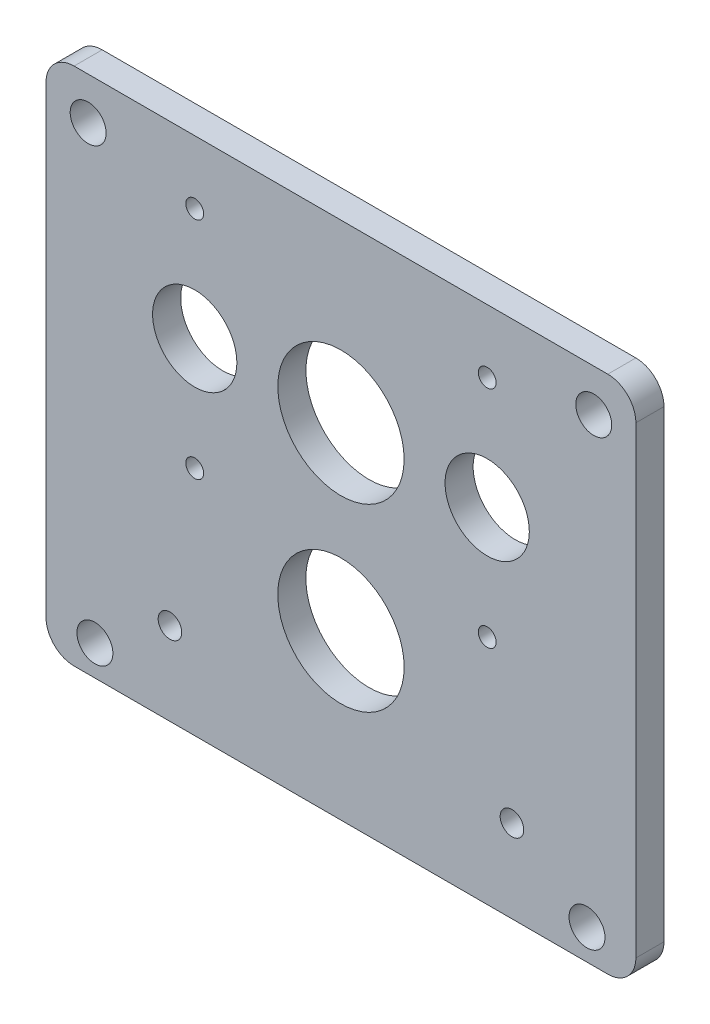
ISO-10303-21;
HEADER;
FILE_DESCRIPTION(('STEP AP214'),'2;1');
FILE_NAME('part.step','',(''),(''),'','','');
FILE_SCHEMA(('AUTOMOTIVE_DESIGN { 1 0 10303 214 1 1 1 1 }'));
ENDSEC;
DATA;
#1=APPLICATION_CONTEXT('core data for automotive mechanical design processes');
#2=APPLICATION_PROTOCOL_DEFINITION('international standard','automotive_design',2000,#1);
#3=PRODUCT_CONTEXT('',#1,'mechanical');
#4=PRODUCT('Part','Part','',(#3));
#5=PRODUCT_RELATED_PRODUCT_CATEGORY('part','',(#4));
#6=PRODUCT_DEFINITION_FORMATION('','',#4);
#7=PRODUCT_DEFINITION_CONTEXT('part definition',#1,'design');
#8=PRODUCT_DEFINITION('design','',#6,#7);
#9=PRODUCT_DEFINITION_SHAPE('','',#8);
#10=(LENGTH_UNIT() NAMED_UNIT(*) SI_UNIT(.MILLI.,.METRE.));
#11=(NAMED_UNIT(*) PLANE_ANGLE_UNIT() SI_UNIT($,.RADIAN.));
#12=(NAMED_UNIT(*) SI_UNIT($,.STERADIAN.) SOLID_ANGLE_UNIT());
#13=UNCERTAINTY_MEASURE_WITH_UNIT(LENGTH_MEASURE(1.E-05),#10,'distance_accuracy_value','');
#14=(GEOMETRIC_REPRESENTATION_CONTEXT(3) GLOBAL_UNCERTAINTY_ASSIGNED_CONTEXT((#13)) GLOBAL_UNIT_ASSIGNED_CONTEXT((#10,
#11,#12)) REPRESENTATION_CONTEXT('',''));
#15=CARTESIAN_POINT('',(0.,0.,0.));
#16=DIRECTION('',(0.,0.,1.));
#17=DIRECTION('',(1.,0.,0.));
#18=AXIS2_PLACEMENT_3D('',#15,#16,#17);
#19=CARTESIAN_POINT('',(0.,0.,3.175));
#20=DIRECTION('',(0.,0.,1.));
#21=DIRECTION('',(1.,0.,0.));
#22=AXIS2_PLACEMENT_3D('',#19,#20,#21);
#23=PLANE('',#22);
#24=CARTESIAN_POINT('',(57.15,70.8914,3.175));
#25=DIRECTION('',(0.,0.,1.));
#26=DIRECTION('',(1.,0.,0.));
#27=AXIS2_PLACEMENT_3D('',#24,#25,#26);
#28=CIRCLE('',#27,4.064);
#29=CARTESIAN_POINT('',(61.214,70.8914,3.175));
#30=VERTEX_POINT('',#29);
#31=EDGE_CURVE('E247',#30,#30,#28,.T.);
#32=ORIENTED_EDGE('',*,*,#31,.F.);
#33=EDGE_LOOP('',(#32));
#34=FACE_BOUND('',#33,.T.);
#35=CARTESIAN_POINT('',(-55.626,-30.2006,3.175));
#36=DIRECTION('',(0.,0.,1.));
#37=DIRECTION('',(1.,0.,0.));
#38=AXIS2_PLACEMENT_3D('',#35,#36,#37);
#39=CIRCLE('',#38,4.06400000000001);
#40=CARTESIAN_POINT('',(-51.562,-30.2006,3.175));
#41=VERTEX_POINT('',#40);
#42=EDGE_CURVE('E235',#41,#41,#39,.T.);
#43=ORIENTED_EDGE('',*,*,#42,.F.);
#44=EDGE_LOOP('',(#43));
#45=FACE_BOUND('',#44,.T.);
#46=CARTESIAN_POINT('',(-38.6588,-18.3134,3.175));
#47=DIRECTION('',(0.,0.,1.));
#48=DIRECTION('',(1.,0.,0.));
#49=AXIS2_PLACEMENT_3D('',#46,#47,#48);
#50=CIRCLE('',#49,2.667);
#51=CARTESIAN_POINT('',(-35.9918,-18.3134,3.175));
#52=VERTEX_POINT('',#51);
#53=EDGE_CURVE('E223',#52,#52,#50,.T.);
#54=ORIENTED_EDGE('',*,*,#53,.F.);
#55=EDGE_LOOP('',(#54));
#56=FACE_BOUND('',#55,.T.);
#57=CARTESIAN_POINT('',(-57.15,70.8914,3.175));
#58=DIRECTION('',(0.,0.,1.));
#59=DIRECTION('',(1.,0.,0.));
#60=AXIS2_PLACEMENT_3D('',#57,#58,#59);
#61=CIRCLE('',#60,4.064);
#62=CARTESIAN_POINT('',(-53.086,70.8914,3.175));
#63=VERTEX_POINT('',#62);
#64=EDGE_CURVE('E211',#63,#63,#61,.T.);
#65=ORIENTED_EDGE('',*,*,#64,.F.);
#66=EDGE_LOOP('',(#65));
#67=FACE_BOUND('',#66,.T.);
#68=CARTESIAN_POINT('',(0.,0.,3.175));
#69=DIRECTION('',(0.,0.,1.));
#70=DIRECTION('',(1.,0.,0.));
#71=AXIS2_PLACEMENT_3D('',#68,#69,#70);
#72=CIRCLE('',#71,14.2875);
#73=CARTESIAN_POINT('',(14.2875,0.,3.175));
#74=VERTEX_POINT('',#73);
#75=EDGE_CURVE('E199',#74,#74,#72,.T.);
#76=ORIENTED_EDGE('',*,*,#75,.F.);
#77=EDGE_LOOP('',(#76));
#78=FACE_BOUND('',#77,.T.);
#79=CARTESIAN_POINT('',(-33.0581,40.7162,3.175));
#80=DIRECTION('',(0.,0.,1.));
#81=DIRECTION('',(1.,0.,0.));
#82=AXIS2_PLACEMENT_3D('',#79,#80,#81);
#83=CIRCLE('',#82,9.525);
#84=CARTESIAN_POINT('',(-23.5331,40.7162,3.175));
#85=VERTEX_POINT('',#84);
#86=EDGE_CURVE('E187',#85,#85,#83,.T.);
#87=ORIENTED_EDGE('',*,*,#86,.F.);
#88=EDGE_LOOP('',(#87));
#89=FACE_BOUND('',#88,.T.);
#90=CARTESIAN_POINT('',(0.,40.7162,3.175));
#91=DIRECTION('',(0.,0.,1.));
#92=DIRECTION('',(1.,0.,0.));
#93=AXIS2_PLACEMENT_3D('',#90,#91,#92);
#94=CIRCLE('',#93,14.2748);
#95=CARTESIAN_POINT('',(14.2748,40.7162,3.175));
#96=VERTEX_POINT('',#95);
#97=EDGE_CURVE('E133',#96,#96,#94,.T.);
#98=ORIENTED_EDGE('',*,*,#97,.F.);
#99=EDGE_LOOP('',(#98));
#100=FACE_BOUND('',#99,.T.);
#101=DIRECTION('',(0.,1.,0.));
#102=VECTOR('',#101,1.);
#103=CARTESIAN_POINT('',(66.675,80.4164,3.175));
#104=LINE('',#103,#102);
#105=CARTESIAN_POINT('',(66.675,-30.7086,3.175));
#106=VERTEX_POINT('',#105);
#107=CARTESIAN_POINT('',(66.675,74.0664,3.175));
#108=VERTEX_POINT('',#107);
#109=EDGE_CURVE('E138',#106,#108,#104,.T.);
#110=ORIENTED_EDGE('',*,*,#109,.T.);
#111=CARTESIAN_POINT('',(60.325,74.0664,3.175));
#112=DIRECTION('',(0.,0.,1.));
#113=DIRECTION('',(1.,0.,0.));
#114=AXIS2_PLACEMENT_3D('',#111,#112,#113);
#115=CIRCLE('',#114,6.35);
#116=CARTESIAN_POINT('',(60.325,80.4164,3.175));
#117=VERTEX_POINT('',#116);
#118=EDGE_CURVE('E153',#108,#117,#115,.T.);
#119=ORIENTED_EDGE('',*,*,#118,.T.);
#120=DIRECTION('',(-1.,0.,0.));
#121=VECTOR('',#120,1.);
#122=CARTESIAN_POINT('',(-66.675,80.4164,3.175));
#123=LINE('',#122,#121);
#124=CARTESIAN_POINT('',(-60.325,80.4164,3.175));
#125=VERTEX_POINT('',#124);
#126=EDGE_CURVE('E120',#117,#125,#123,.T.);
#127=ORIENTED_EDGE('',*,*,#126,.T.);
#128=CARTESIAN_POINT('',(-60.325,74.0664,3.175));
#129=DIRECTION('',(0.,0.,1.));
#130=DIRECTION('',(1.,0.,0.));
#131=AXIS2_PLACEMENT_3D('',#128,#129,#130);
#132=CIRCLE('',#131,6.35);
#133=CARTESIAN_POINT('',(-66.675,74.0664,3.175));
#134=VERTEX_POINT('',#133);
#135=EDGE_CURVE('E148',#125,#134,#132,.T.);
#136=ORIENTED_EDGE('',*,*,#135,.T.);
#137=DIRECTION('',(0.,-1.,0.));
#138=VECTOR('',#137,1.);
#139=CARTESIAN_POINT('',(-66.675,80.4164,3.175));
#140=LINE('',#139,#138);
#141=CARTESIAN_POINT('',(-66.675,-30.7086,3.175));
#142=VERTEX_POINT('',#141);
#143=EDGE_CURVE('E164',#134,#142,#140,.T.);
#144=ORIENTED_EDGE('',*,*,#143,.T.);
#145=CARTESIAN_POINT('',(-60.325,-30.7086,3.175));
#146=DIRECTION('',(0.,0.,1.));
#147=DIRECTION('',(1.,0.,0.));
#148=AXIS2_PLACEMENT_3D('',#145,#146,#147);
#149=CIRCLE('',#148,6.35);
#150=CARTESIAN_POINT('',(-60.325,-37.0586,3.175));
#151=VERTEX_POINT('',#150);
#152=EDGE_CURVE('E56',#142,#151,#149,.T.);
#153=ORIENTED_EDGE('',*,*,#152,.T.);
#154=DIRECTION('',(1.,0.,0.));
#155=VECTOR('',#154,1.);
#156=CARTESIAN_POINT('',(-66.675,-37.0586,3.175));
#157=LINE('',#156,#155);
#158=CARTESIAN_POINT('',(60.325,-37.0586,3.175));
#159=VERTEX_POINT('',#158);
#160=EDGE_CURVE('E139',#151,#159,#157,.T.);
#161=ORIENTED_EDGE('',*,*,#160,.T.);
#162=CARTESIAN_POINT('',(60.325,-30.7086,3.175));
#163=DIRECTION('',(0.,0.,1.));
#164=DIRECTION('',(1.,0.,0.));
#165=AXIS2_PLACEMENT_3D('',#162,#163,#164);
#166=CIRCLE('',#165,6.35);
#167=EDGE_CURVE('E151',#159,#106,#166,.T.);
#168=ORIENTED_EDGE('',*,*,#167,.T.);
#169=EDGE_LOOP('',(#110,#119,#127,#136,#144,#153,#161,#168));
#170=FACE_BOUND('',#169,.T.);
#171=CARTESIAN_POINT('',(33.0581,40.7162,3.175));
#172=DIRECTION('',(0.,0.,1.));
#173=DIRECTION('',(1.,0.,0.));
#174=AXIS2_PLACEMENT_3D('',#171,#172,#173);
#175=CIRCLE('',#174,9.52500000000001);
#176=CARTESIAN_POINT('',(42.5831,40.7162,3.175));
#177=VERTEX_POINT('',#176);
#178=EDGE_CURVE('E181',#177,#177,#175,.T.);
#179=ORIENTED_EDGE('',*,*,#178,.F.);
#180=EDGE_LOOP('',(#179));
#181=FACE_BOUND('',#180,.T.);
#182=CARTESIAN_POINT('',(-33.0581,66.1162,3.175));
#183=DIRECTION('',(0.,0.,1.));
#184=DIRECTION('',(1.,0.,0.));
#185=AXIS2_PLACEMENT_3D('',#182,#183,#184);
#186=CIRCLE('',#185,2.0193);
#187=CARTESIAN_POINT('',(-31.0388,66.1162,3.175));
#188=VERTEX_POINT('',#187);
#189=EDGE_CURVE('E193',#188,#188,#186,.T.);
#190=ORIENTED_EDGE('',*,*,#189,.F.);
#191=EDGE_LOOP('',(#190));
#192=FACE_BOUND('',#191,.T.);
#193=CARTESIAN_POINT('',(-33.0581,15.3162,3.175));
#194=DIRECTION('',(0.,0.,1.));
#195=DIRECTION('',(1.,0.,0.));
#196=AXIS2_PLACEMENT_3D('',#193,#194,#195);
#197=CIRCLE('',#196,2.0193);
#198=CARTESIAN_POINT('',(-31.0388,15.3162,3.175));
#199=VERTEX_POINT('',#198);
#200=EDGE_CURVE('E205',#199,#199,#197,.T.);
#201=ORIENTED_EDGE('',*,*,#200,.F.);
#202=EDGE_LOOP('',(#201));
#203=FACE_BOUND('',#202,.T.);
#204=CARTESIAN_POINT('',(38.6588,-18.3134,3.175));
#205=DIRECTION('',(0.,0.,1.));
#206=DIRECTION('',(1.,0.,0.));
#207=AXIS2_PLACEMENT_3D('',#204,#205,#206);
#208=CIRCLE('',#207,2.667);
#209=CARTESIAN_POINT('',(41.3258,-18.3134,3.175));
#210=VERTEX_POINT('',#209);
#211=EDGE_CURVE('E217',#210,#210,#208,.T.);
#212=ORIENTED_EDGE('',*,*,#211,.F.);
#213=EDGE_LOOP('',(#212));
#214=FACE_BOUND('',#213,.T.);
#215=CARTESIAN_POINT('',(33.0581,66.1162,3.175));
#216=DIRECTION('',(0.,0.,1.));
#217=DIRECTION('',(1.,0.,0.));
#218=AXIS2_PLACEMENT_3D('',#215,#216,#217);
#219=CIRCLE('',#218,2.0193);
#220=CARTESIAN_POINT('',(35.0774,66.1162,3.175));
#221=VERTEX_POINT('',#220);
#222=EDGE_CURVE('E229',#221,#221,#219,.T.);
#223=ORIENTED_EDGE('',*,*,#222,.F.);
#224=EDGE_LOOP('',(#223));
#225=FACE_BOUND('',#224,.T.);
#226=CARTESIAN_POINT('',(33.0581,15.3162,3.175));
#227=DIRECTION('',(0.,0.,1.));
#228=DIRECTION('',(1.,0.,0.));
#229=AXIS2_PLACEMENT_3D('',#226,#227,#228);
#230=CIRCLE('',#229,2.0193);
#231=CARTESIAN_POINT('',(35.0774,15.3162,3.175));
#232=VERTEX_POINT('',#231);
#233=EDGE_CURVE('E241',#232,#232,#230,.T.);
#234=ORIENTED_EDGE('',*,*,#233,.F.);
#235=EDGE_LOOP('',(#234));
#236=FACE_BOUND('',#235,.T.);
#237=CARTESIAN_POINT('',(55.626,-30.2006,3.175));
#238=DIRECTION('',(0.,0.,1.));
#239=DIRECTION('',(1.,0.,0.));
#240=AXIS2_PLACEMENT_3D('',#237,#238,#239);
#241=CIRCLE('',#240,4.064);
#242=CARTESIAN_POINT('',(59.69,-30.2006,3.175));
#243=VERTEX_POINT('',#242);
#244=EDGE_CURVE('E253',#243,#243,#241,.T.);
#245=ORIENTED_EDGE('',*,*,#244,.F.);
#246=EDGE_LOOP('',(#245));
#247=FACE_BOUND('',#246,.T.);
#248=ADVANCED_FACE('F34',(#34,#45,#56,#67,#78,#89,#100,#170,#181,#192,#203,#214,#225,#236,#247),
#23,.T.);
#249=CARTESIAN_POINT('',(0.,0.,-3.175));
#250=DIRECTION('',(0.,0.,1.));
#251=DIRECTION('',(1.,0.,0.));
#252=AXIS2_PLACEMENT_3D('',#249,#250,#251);
#253=PLANE('',#252);
#254=DIRECTION('',(-1.,0.,0.));
#255=VECTOR('',#254,1.);
#256=CARTESIAN_POINT('',(-66.675,80.4164,-3.175));
#257=LINE('',#256,#255);
#258=CARTESIAN_POINT('',(60.325,80.4164,-3.175));
#259=VERTEX_POINT('',#258);
#260=CARTESIAN_POINT('',(-60.325,80.4164,-3.175));
#261=VERTEX_POINT('',#260);
#262=EDGE_CURVE('E117',#259,#261,#257,.T.);
#263=ORIENTED_EDGE('',*,*,#262,.F.);
#264=CARTESIAN_POINT('',(60.325,74.0664,-3.175));
#265=DIRECTION('',(0.,0.,1.));
#266=DIRECTION('',(1.,0.,0.));
#267=AXIS2_PLACEMENT_3D('',#264,#265,#266);
#268=CIRCLE('',#267,6.35);
#269=CARTESIAN_POINT('',(66.675,74.0664,-3.175));
#270=VERTEX_POINT('',#269);
#271=EDGE_CURVE('E100',#259,#270,#268,.F.);
#272=ORIENTED_EDGE('',*,*,#271,.T.);
#273=DIRECTION('',(0.,1.,0.));
#274=VECTOR('',#273,1.);
#275=CARTESIAN_POINT('',(66.675,80.4164,-3.175));
#276=LINE('',#275,#274);
#277=CARTESIAN_POINT('',(66.675,-30.7086,-3.175));
#278=VERTEX_POINT('',#277);
#279=EDGE_CURVE('E128',#278,#270,#276,.T.);
#280=ORIENTED_EDGE('',*,*,#279,.F.);
#281=CARTESIAN_POINT('',(60.325,-30.7086,-3.175));
#282=DIRECTION('',(0.,0.,1.));
#283=DIRECTION('',(1.,0.,0.));
#284=AXIS2_PLACEMENT_3D('',#281,#282,#283);
#285=CIRCLE('',#284,6.35);
#286=CARTESIAN_POINT('',(60.325,-37.0586,-3.175));
#287=VERTEX_POINT('',#286);
#288=EDGE_CURVE('E111',#278,#287,#285,.F.);
#289=ORIENTED_EDGE('',*,*,#288,.T.);
#290=DIRECTION('',(1.,0.,0.));
#291=VECTOR('',#290,1.);
#292=CARTESIAN_POINT('',(-66.675,-37.0586,-3.175));
#293=LINE('',#292,#291);
#294=CARTESIAN_POINT('',(-60.325,-37.0586,-3.175));
#295=VERTEX_POINT('',#294);
#296=EDGE_CURVE('E131',#295,#287,#293,.T.);
#297=ORIENTED_EDGE('',*,*,#296,.F.);
#298=CARTESIAN_POINT('',(-60.325,-30.7086,-3.175));
#299=DIRECTION('',(0.,0.,1.));
#300=DIRECTION('',(1.,0.,0.));
#301=AXIS2_PLACEMENT_3D('',#298,#299,#300);
#302=CIRCLE('',#301,6.35);
#303=CARTESIAN_POINT('',(-66.675,-30.7086,-3.175));
#304=VERTEX_POINT('',#303);
#305=EDGE_CURVE('E142',#295,#304,#302,.F.);
#306=ORIENTED_EDGE('',*,*,#305,.T.);
#307=DIRECTION('',(0.,-1.,0.));
#308=VECTOR('',#307,1.);
#309=CARTESIAN_POINT('',(-66.675,80.4164,-3.175));
#310=LINE('',#309,#308);
#311=CARTESIAN_POINT('',(-66.675,74.0664,-3.175));
#312=VERTEX_POINT('',#311);
#313=EDGE_CURVE('E127',#312,#304,#310,.T.);
#314=ORIENTED_EDGE('',*,*,#313,.F.);
#315=CARTESIAN_POINT('',(-60.325,74.0664,-3.175));
#316=DIRECTION('',(0.,0.,1.));
#317=DIRECTION('',(1.,0.,0.));
#318=AXIS2_PLACEMENT_3D('',#315,#316,#317);
#319=CIRCLE('',#318,6.35);
#320=EDGE_CURVE('E121',#312,#261,#319,.F.);
#321=ORIENTED_EDGE('',*,*,#320,.T.);
#322=EDGE_LOOP('',(#263,#272,#280,#289,#297,#306,#314,#321));
#323=FACE_BOUND('',#322,.T.);
#324=CARTESIAN_POINT('',(0.,40.7162,-3.175));
#325=DIRECTION('',(0.,0.,1.));
#326=DIRECTION('',(1.,0.,0.));
#327=AXIS2_PLACEMENT_3D('',#324,#325,#326);
#328=CIRCLE('',#327,14.2748);
#329=CARTESIAN_POINT('',(14.2748,40.7162,-3.175));
#330=VERTEX_POINT('',#329);
#331=EDGE_CURVE('E178',#330,#330,#328,.T.);
#332=ORIENTED_EDGE('',*,*,#331,.T.);
#333=EDGE_LOOP('',(#332));
#334=FACE_BOUND('',#333,.T.);
#335=CARTESIAN_POINT('',(33.0581,40.7162,-3.175));
#336=DIRECTION('',(0.,0.,1.));
#337=DIRECTION('',(1.,0.,0.));
#338=AXIS2_PLACEMENT_3D('',#335,#336,#337);
#339=CIRCLE('',#338,9.52500000000001);
#340=CARTESIAN_POINT('',(42.5831,40.7162,-3.175));
#341=VERTEX_POINT('',#340);
#342=EDGE_CURVE('E184',#341,#341,#339,.T.);
#343=ORIENTED_EDGE('',*,*,#342,.T.);
#344=EDGE_LOOP('',(#343));
#345=FACE_BOUND('',#344,.T.);
#346=CARTESIAN_POINT('',(-33.0581,40.7162,-3.175));
#347=DIRECTION('',(0.,0.,1.));
#348=DIRECTION('',(1.,0.,0.));
#349=AXIS2_PLACEMENT_3D('',#346,#347,#348);
#350=CIRCLE('',#349,9.525);
#351=CARTESIAN_POINT('',(-23.5331,40.7162,-3.175));
#352=VERTEX_POINT('',#351);
#353=EDGE_CURVE('E190',#352,#352,#350,.T.);
#354=ORIENTED_EDGE('',*,*,#353,.T.);
#355=EDGE_LOOP('',(#354));
#356=FACE_BOUND('',#355,.T.);
#357=CARTESIAN_POINT('',(-33.0581,66.1162,-3.175));
#358=DIRECTION('',(0.,0.,1.));
#359=DIRECTION('',(1.,0.,0.));
#360=AXIS2_PLACEMENT_3D('',#357,#358,#359);
#361=CIRCLE('',#360,2.0193);
#362=CARTESIAN_POINT('',(-31.0388,66.1162,-3.175));
#363=VERTEX_POINT('',#362);
#364=EDGE_CURVE('E196',#363,#363,#361,.T.);
#365=ORIENTED_EDGE('',*,*,#364,.T.);
#366=EDGE_LOOP('',(#365));
#367=FACE_BOUND('',#366,.T.);
#368=CARTESIAN_POINT('',(0.,0.,-3.175));
#369=DIRECTION('',(0.,0.,1.));
#370=DIRECTION('',(1.,0.,0.));
#371=AXIS2_PLACEMENT_3D('',#368,#369,#370);
#372=CIRCLE('',#371,14.2875);
#373=CARTESIAN_POINT('',(14.2875,0.,-3.175));
#374=VERTEX_POINT('',#373);
#375=EDGE_CURVE('E202',#374,#374,#372,.T.);
#376=ORIENTED_EDGE('',*,*,#375,.T.);
#377=EDGE_LOOP('',(#376));
#378=FACE_BOUND('',#377,.T.);
#379=CARTESIAN_POINT('',(-33.0581,15.3162,-3.175));
#380=DIRECTION('',(0.,0.,1.));
#381=DIRECTION('',(1.,0.,0.));
#382=AXIS2_PLACEMENT_3D('',#379,#380,#381);
#383=CIRCLE('',#382,2.0193);
#384=CARTESIAN_POINT('',(-31.0388,15.3162,-3.175));
#385=VERTEX_POINT('',#384);
#386=EDGE_CURVE('E208',#385,#385,#383,.T.);
#387=ORIENTED_EDGE('',*,*,#386,.T.);
#388=EDGE_LOOP('',(#387));
#389=FACE_BOUND('',#388,.T.);
#390=CARTESIAN_POINT('',(-57.15,70.8914,-3.175));
#391=DIRECTION('',(0.,0.,1.));
#392=DIRECTION('',(1.,0.,0.));
#393=AXIS2_PLACEMENT_3D('',#390,#391,#392);
#394=CIRCLE('',#393,4.064);
#395=CARTESIAN_POINT('',(-53.086,70.8914,-3.175));
#396=VERTEX_POINT('',#395);
#397=EDGE_CURVE('E214',#396,#396,#394,.T.);
#398=ORIENTED_EDGE('',*,*,#397,.T.);
#399=EDGE_LOOP('',(#398));
#400=FACE_BOUND('',#399,.T.);
#401=CARTESIAN_POINT('',(38.6588,-18.3134,-3.175));
#402=DIRECTION('',(0.,0.,1.));
#403=DIRECTION('',(1.,0.,0.));
#404=AXIS2_PLACEMENT_3D('',#401,#402,#403);
#405=CIRCLE('',#404,2.667);
#406=CARTESIAN_POINT('',(41.3258,-18.3134,-3.175));
#407=VERTEX_POINT('',#406);
#408=EDGE_CURVE('E220',#407,#407,#405,.T.);
#409=ORIENTED_EDGE('',*,*,#408,.T.);
#410=EDGE_LOOP('',(#409));
#411=FACE_BOUND('',#410,.T.);
#412=CARTESIAN_POINT('',(-38.6588,-18.3134,-3.175));
#413=DIRECTION('',(0.,0.,1.));
#414=DIRECTION('',(1.,0.,0.));
#415=AXIS2_PLACEMENT_3D('',#412,#413,#414);
#416=CIRCLE('',#415,2.667);
#417=CARTESIAN_POINT('',(-35.9918,-18.3134,-3.175));
#418=VERTEX_POINT('',#417);
#419=EDGE_CURVE('E226',#418,#418,#416,.T.);
#420=ORIENTED_EDGE('',*,*,#419,.T.);
#421=EDGE_LOOP('',(#420));
#422=FACE_BOUND('',#421,.T.);
#423=CARTESIAN_POINT('',(33.0581,66.1162,-3.175));
#424=DIRECTION('',(0.,0.,1.));
#425=DIRECTION('',(1.,0.,0.));
#426=AXIS2_PLACEMENT_3D('',#423,#424,#425);
#427=CIRCLE('',#426,2.0193);
#428=CARTESIAN_POINT('',(35.0774,66.1162,-3.175));
#429=VERTEX_POINT('',#428);
#430=EDGE_CURVE('E232',#429,#429,#427,.T.);
#431=ORIENTED_EDGE('',*,*,#430,.T.);
#432=EDGE_LOOP('',(#431));
#433=FACE_BOUND('',#432,.T.);
#434=CARTESIAN_POINT('',(-55.626,-30.2006,-3.175));
#435=DIRECTION('',(0.,0.,1.));
#436=DIRECTION('',(1.,0.,0.));
#437=AXIS2_PLACEMENT_3D('',#434,#435,#436);
#438=CIRCLE('',#437,4.06400000000001);
#439=CARTESIAN_POINT('',(-51.562,-30.2006,-3.175));
#440=VERTEX_POINT('',#439);
#441=EDGE_CURVE('E238',#440,#440,#438,.T.);
#442=ORIENTED_EDGE('',*,*,#441,.T.);
#443=EDGE_LOOP('',(#442));
#444=FACE_BOUND('',#443,.T.);
#445=CARTESIAN_POINT('',(33.0581,15.3162,-3.175));
#446=DIRECTION('',(0.,0.,1.));
#447=DIRECTION('',(1.,0.,0.));
#448=AXIS2_PLACEMENT_3D('',#445,#446,#447);
#449=CIRCLE('',#448,2.0193);
#450=CARTESIAN_POINT('',(35.0774,15.3162,-3.175));
#451=VERTEX_POINT('',#450);
#452=EDGE_CURVE('E244',#451,#451,#449,.T.);
#453=ORIENTED_EDGE('',*,*,#452,.T.);
#454=EDGE_LOOP('',(#453));
#455=FACE_BOUND('',#454,.T.);
#456=CARTESIAN_POINT('',(57.15,70.8914,-3.175));
#457=DIRECTION('',(0.,0.,1.));
#458=DIRECTION('',(1.,0.,0.));
#459=AXIS2_PLACEMENT_3D('',#456,#457,#458);
#460=CIRCLE('',#459,4.064);
#461=CARTESIAN_POINT('',(61.214,70.8914,-3.175));
#462=VERTEX_POINT('',#461);
#463=EDGE_CURVE('E250',#462,#462,#460,.T.);
#464=ORIENTED_EDGE('',*,*,#463,.T.);
#465=EDGE_LOOP('',(#464));
#466=FACE_BOUND('',#465,.T.);
#467=CARTESIAN_POINT('',(55.626,-30.2006,-3.175));
#468=DIRECTION('',(0.,0.,1.));
#469=DIRECTION('',(1.,0.,0.));
#470=AXIS2_PLACEMENT_3D('',#467,#468,#469);
#471=CIRCLE('',#470,4.064);
#472=CARTESIAN_POINT('',(59.69,-30.2006,-3.175));
#473=VERTEX_POINT('',#472);
#474=EDGE_CURVE('E256',#473,#473,#471,.T.);
#475=ORIENTED_EDGE('',*,*,#474,.T.);
#476=EDGE_LOOP('',(#475));
#477=FACE_BOUND('',#476,.T.);
#478=ADVANCED_FACE('F124',(#323,#334,#345,#356,#367,#378,#389,#400,#411,#422,#433,#444,#455,
#466,#477),#253,.F.);
#479=CARTESIAN_POINT('',(66.675,80.4164,3.175));
#480=DIRECTION('',(-1.,0.,0.));
#481=DIRECTION('',(0.,0.,1.));
#482=AXIS2_PLACEMENT_3D('',#479,#480,#481);
#483=PLANE('',#482);
#484=ORIENTED_EDGE('',*,*,#279,.T.);
#485=DIRECTION('',(0.,0.,-1.));
#486=VECTOR('',#485,1.);
#487=CARTESIAN_POINT('',(66.675,74.0664,3.175));
#488=LINE('',#487,#486);
#489=EDGE_CURVE('E105',#270,#108,#488,.F.);
#490=ORIENTED_EDGE('',*,*,#489,.T.);
#491=ORIENTED_EDGE('',*,*,#109,.F.);
#492=DIRECTION('',(0.,0.,-1.));
#493=VECTOR('',#492,1.);
#494=CARTESIAN_POINT('',(66.675,-30.7086,3.175));
#495=LINE('',#494,#493);
#496=EDGE_CURVE('E110',#106,#278,#495,.T.);
#497=ORIENTED_EDGE('',*,*,#496,.T.);
#498=EDGE_LOOP('',(#484,#490,#491,#497));
#499=FACE_BOUND('',#498,.T.);
#500=ADVANCED_FACE('F271',(#499),#483,.F.);
#501=CARTESIAN_POINT('',(-66.675,80.4164,3.175));
#502=DIRECTION('',(0.,-1.,0.));
#503=DIRECTION('',(0.,0.,-1.));
#504=AXIS2_PLACEMENT_3D('',#501,#502,#503);
#505=PLANE('',#504);
#506=ORIENTED_EDGE('',*,*,#126,.F.);
#507=DIRECTION('',(0.,0.,-1.));
#508=VECTOR('',#507,1.);
#509=CARTESIAN_POINT('',(60.325,80.4164,3.175));
#510=LINE('',#509,#508);
#511=EDGE_CURVE('E104',#117,#259,#510,.T.);
#512=ORIENTED_EDGE('',*,*,#511,.T.);
#513=ORIENTED_EDGE('',*,*,#262,.T.);
#514=DIRECTION('',(0.,0.,-1.));
#515=VECTOR('',#514,1.);
#516=CARTESIAN_POINT('',(-60.325,80.4164,3.175));
#517=LINE('',#516,#515);
#518=EDGE_CURVE('E122',#261,#125,#517,.F.);
#519=ORIENTED_EDGE('',*,*,#518,.T.);
#520=EDGE_LOOP('',(#506,#512,#513,#519));
#521=FACE_BOUND('',#520,.T.);
#522=ADVANCED_FACE('F116',(#521),#505,.F.);
#523=CARTESIAN_POINT('',(-66.675,80.4164,3.175));
#524=DIRECTION('',(1.,0.,0.));
#525=DIRECTION('',(0.,1.,0.));
#526=AXIS2_PLACEMENT_3D('',#523,#524,#525);
#527=PLANE('',#526);
#528=ORIENTED_EDGE('',*,*,#313,.T.);
#529=DIRECTION('',(0.,0.,-1.));
#530=VECTOR('',#529,1.);
#531=CARTESIAN_POINT('',(-66.675,-30.7086,3.175));
#532=LINE('',#531,#530);
#533=EDGE_CURVE('E11',#304,#142,#532,.F.);
#534=ORIENTED_EDGE('',*,*,#533,.T.);
#535=ORIENTED_EDGE('',*,*,#143,.F.);
#536=DIRECTION('',(0.,0.,-1.));
#537=VECTOR('',#536,1.);
#538=CARTESIAN_POINT('',(-66.675,74.0664,3.175));
#539=LINE('',#538,#537);
#540=EDGE_CURVE('E42',#134,#312,#539,.T.);
#541=ORIENTED_EDGE('',*,*,#540,.T.);
#542=EDGE_LOOP('',(#528,#534,#535,#541));
#543=FACE_BOUND('',#542,.T.);
#544=ADVANCED_FACE('F162',(#543),#527,.F.);
#545=CARTESIAN_POINT('',(-66.675,-37.0586,3.175));
#546=DIRECTION('',(0.,1.,0.));
#547=DIRECTION('',(0.,0.,1.));
#548=AXIS2_PLACEMENT_3D('',#545,#546,#547);
#549=PLANE('',#548);
#550=ORIENTED_EDGE('',*,*,#296,.T.);
#551=DIRECTION('',(0.,0.,-1.));
#552=VECTOR('',#551,1.);
#553=CARTESIAN_POINT('',(60.325,-37.0586,3.175));
#554=LINE('',#553,#552);
#555=EDGE_CURVE('E49',#287,#159,#554,.F.);
#556=ORIENTED_EDGE('',*,*,#555,.T.);
#557=ORIENTED_EDGE('',*,*,#160,.F.);
#558=DIRECTION('',(0.,0.,-1.));
#559=VECTOR('',#558,1.);
#560=CARTESIAN_POINT('',(-60.325,-37.0586,3.175));
#561=LINE('',#560,#559);
#562=EDGE_CURVE('E155',#151,#295,#561,.T.);
#563=ORIENTED_EDGE('',*,*,#562,.T.);
#564=EDGE_LOOP('',(#550,#556,#557,#563));
#565=FACE_BOUND('',#564,.T.);
#566=ADVANCED_FACE('F171',(#565),#549,.F.);
#567=CARTESIAN_POINT('',(0.,40.7162,3.175));
#568=DIRECTION('',(0.,0.,-1.));
#569=DIRECTION('',(-1.,0.,0.));
#570=AXIS2_PLACEMENT_3D('',#567,#568,#569);
#571=CYLINDRICAL_SURFACE('',#570,14.2748);
#572=ORIENTED_EDGE('',*,*,#97,.T.);
#573=EDGE_LOOP('',(#572));
#574=FACE_BOUND('',#573,.T.);
#575=ORIENTED_EDGE('',*,*,#331,.F.);
#576=EDGE_LOOP('',(#575));
#577=FACE_BOUND('',#576,.T.);
#578=ADVANCED_FACE('F276',(#574,#577),#571,.F.);
#579=CARTESIAN_POINT('',(33.0581,40.7162,3.175));
#580=DIRECTION('',(0.,0.,-1.));
#581=DIRECTION('',(-1.,0.,0.));
#582=AXIS2_PLACEMENT_3D('',#579,#580,#581);
#583=CYLINDRICAL_SURFACE('',#582,9.52500000000001);
#584=ORIENTED_EDGE('',*,*,#178,.T.);
#585=EDGE_LOOP('',(#584));
#586=FACE_BOUND('',#585,.T.);
#587=ORIENTED_EDGE('',*,*,#342,.F.);
#588=EDGE_LOOP('',(#587));
#589=FACE_BOUND('',#588,.T.);
#590=ADVANCED_FACE('F367',(#586,#589),#583,.F.);
#591=CARTESIAN_POINT('',(-33.0581,40.7162,3.175));
#592=DIRECTION('',(0.,0.,-1.));
#593=DIRECTION('',(-1.,0.,0.));
#594=AXIS2_PLACEMENT_3D('',#591,#592,#593);
#595=CYLINDRICAL_SURFACE('',#594,9.525);
#596=ORIENTED_EDGE('',*,*,#86,.T.);
#597=EDGE_LOOP('',(#596));
#598=FACE_BOUND('',#597,.T.);
#599=ORIENTED_EDGE('',*,*,#353,.F.);
#600=EDGE_LOOP('',(#599));
#601=FACE_BOUND('',#600,.T.);
#602=ADVANCED_FACE('F364',(#598,#601),#595,.F.);
#603=CARTESIAN_POINT('',(-33.0581,66.1162,3.175));
#604=DIRECTION('',(0.,0.,-1.));
#605=DIRECTION('',(-1.,0.,0.));
#606=AXIS2_PLACEMENT_3D('',#603,#604,#605);
#607=CYLINDRICAL_SURFACE('',#606,2.0193);
#608=ORIENTED_EDGE('',*,*,#189,.T.);
#609=EDGE_LOOP('',(#608));
#610=FACE_BOUND('',#609,.T.);
#611=ORIENTED_EDGE('',*,*,#364,.F.);
#612=EDGE_LOOP('',(#611));
#613=FACE_BOUND('',#612,.T.);
#614=ADVANCED_FACE('F360',(#610,#613),#607,.F.);
#615=CARTESIAN_POINT('',(0.,0.,3.175));
#616=DIRECTION('',(0.,0.,-1.));
#617=DIRECTION('',(-1.,0.,0.));
#618=AXIS2_PLACEMENT_3D('',#615,#616,#617);
#619=CYLINDRICAL_SURFACE('',#618,14.2875);
#620=ORIENTED_EDGE('',*,*,#75,.T.);
#621=EDGE_LOOP('',(#620));
#622=FACE_BOUND('',#621,.T.);
#623=ORIENTED_EDGE('',*,*,#375,.F.);
#624=EDGE_LOOP('',(#623));
#625=FACE_BOUND('',#624,.T.);
#626=ADVANCED_FACE('F356',(#622,#625),#619,.F.);
#627=CARTESIAN_POINT('',(-33.0581,15.3162,3.175));
#628=DIRECTION('',(0.,0.,-1.));
#629=DIRECTION('',(-1.,0.,0.));
#630=AXIS2_PLACEMENT_3D('',#627,#628,#629);
#631=CYLINDRICAL_SURFACE('',#630,2.0193);
#632=ORIENTED_EDGE('',*,*,#200,.T.);
#633=EDGE_LOOP('',(#632));
#634=FACE_BOUND('',#633,.T.);
#635=ORIENTED_EDGE('',*,*,#386,.F.);
#636=EDGE_LOOP('',(#635));
#637=FACE_BOUND('',#636,.T.);
#638=ADVANCED_FACE('F352',(#634,#637),#631,.F.);
#639=CARTESIAN_POINT('',(-57.15,70.8914,3.175));
#640=DIRECTION('',(0.,0.,-1.));
#641=DIRECTION('',(-1.,0.,0.));
#642=AXIS2_PLACEMENT_3D('',#639,#640,#641);
#643=CYLINDRICAL_SURFACE('',#642,4.064);
#644=ORIENTED_EDGE('',*,*,#64,.T.);
#645=EDGE_LOOP('',(#644));
#646=FACE_BOUND('',#645,.T.);
#647=ORIENTED_EDGE('',*,*,#397,.F.);
#648=EDGE_LOOP('',(#647));
#649=FACE_BOUND('',#648,.T.);
#650=ADVANCED_FACE('F348',(#646,#649),#643,.F.);
#651=CARTESIAN_POINT('',(38.6588,-18.3134,3.175));
#652=DIRECTION('',(0.,0.,-1.));
#653=DIRECTION('',(-1.,0.,0.));
#654=AXIS2_PLACEMENT_3D('',#651,#652,#653);
#655=CYLINDRICAL_SURFACE('',#654,2.667);
#656=ORIENTED_EDGE('',*,*,#211,.T.);
#657=EDGE_LOOP('',(#656));
#658=FACE_BOUND('',#657,.T.);
#659=ORIENTED_EDGE('',*,*,#408,.F.);
#660=EDGE_LOOP('',(#659));
#661=FACE_BOUND('',#660,.T.);
#662=ADVANCED_FACE('F344',(#658,#661),#655,.F.);
#663=CARTESIAN_POINT('',(-38.6588,-18.3134,3.175));
#664=DIRECTION('',(0.,0.,-1.));
#665=DIRECTION('',(-1.,0.,0.));
#666=AXIS2_PLACEMENT_3D('',#663,#664,#665);
#667=CYLINDRICAL_SURFACE('',#666,2.667);
#668=ORIENTED_EDGE('',*,*,#53,.T.);
#669=EDGE_LOOP('',(#668));
#670=FACE_BOUND('',#669,.T.);
#671=ORIENTED_EDGE('',*,*,#419,.F.);
#672=EDGE_LOOP('',(#671));
#673=FACE_BOUND('',#672,.T.);
#674=ADVANCED_FACE('F340',(#670,#673),#667,.F.);
#675=CARTESIAN_POINT('',(33.0581,66.1162,3.175));
#676=DIRECTION('',(0.,0.,-1.));
#677=DIRECTION('',(-1.,0.,0.));
#678=AXIS2_PLACEMENT_3D('',#675,#676,#677);
#679=CYLINDRICAL_SURFACE('',#678,2.0193);
#680=ORIENTED_EDGE('',*,*,#222,.T.);
#681=EDGE_LOOP('',(#680));
#682=FACE_BOUND('',#681,.T.);
#683=ORIENTED_EDGE('',*,*,#430,.F.);
#684=EDGE_LOOP('',(#683));
#685=FACE_BOUND('',#684,.T.);
#686=ADVANCED_FACE('F336',(#682,#685),#679,.F.);
#687=CARTESIAN_POINT('',(-55.626,-30.2006,3.175));
#688=DIRECTION('',(0.,0.,-1.));
#689=DIRECTION('',(-1.,0.,0.));
#690=AXIS2_PLACEMENT_3D('',#687,#688,#689);
#691=CYLINDRICAL_SURFACE('',#690,4.06400000000001);
#692=ORIENTED_EDGE('',*,*,#42,.T.);
#693=EDGE_LOOP('',(#692));
#694=FACE_BOUND('',#693,.T.);
#695=ORIENTED_EDGE('',*,*,#441,.F.);
#696=EDGE_LOOP('',(#695));
#697=FACE_BOUND('',#696,.T.);
#698=ADVANCED_FACE('F318',(#694,#697),#691,.F.);
#699=CARTESIAN_POINT('',(33.0581,15.3162,3.175));
#700=DIRECTION('',(0.,0.,-1.));
#701=DIRECTION('',(-1.,0.,0.));
#702=AXIS2_PLACEMENT_3D('',#699,#700,#701);
#703=CYLINDRICAL_SURFACE('',#702,2.0193);
#704=ORIENTED_EDGE('',*,*,#233,.T.);
#705=EDGE_LOOP('',(#704));
#706=FACE_BOUND('',#705,.T.);
#707=ORIENTED_EDGE('',*,*,#452,.F.);
#708=EDGE_LOOP('',(#707));
#709=FACE_BOUND('',#708,.T.);
#710=ADVANCED_FACE('F314',(#706,#709),#703,.F.);
#711=CARTESIAN_POINT('',(57.15,70.8914,3.175));
#712=DIRECTION('',(0.,0.,-1.));
#713=DIRECTION('',(-1.,0.,0.));
#714=AXIS2_PLACEMENT_3D('',#711,#712,#713);
#715=CYLINDRICAL_SURFACE('',#714,4.064);
#716=ORIENTED_EDGE('',*,*,#31,.T.);
#717=EDGE_LOOP('',(#716));
#718=FACE_BOUND('',#717,.T.);
#719=ORIENTED_EDGE('',*,*,#463,.F.);
#720=EDGE_LOOP('',(#719));
#721=FACE_BOUND('',#720,.T.);
#722=ADVANCED_FACE('F317',(#718,#721),#715,.F.);
#723=CARTESIAN_POINT('',(55.626,-30.2006,3.175));
#724=DIRECTION('',(0.,0.,-1.));
#725=DIRECTION('',(-1.,0.,0.));
#726=AXIS2_PLACEMENT_3D('',#723,#724,#725);
#727=CYLINDRICAL_SURFACE('',#726,4.064);
#728=ORIENTED_EDGE('',*,*,#244,.T.);
#729=EDGE_LOOP('',(#728));
#730=FACE_BOUND('',#729,.T.);
#731=ORIENTED_EDGE('',*,*,#474,.F.);
#732=EDGE_LOOP('',(#731));
#733=FACE_BOUND('',#732,.T.);
#734=ADVANCED_FACE('F262',(#730,#733),#727,.F.);
#735=CARTESIAN_POINT('',(60.325,74.0664,3.175));
#736=DIRECTION('',(0.,0.,-1.));
#737=DIRECTION('',(-1.,0.,0.));
#738=AXIS2_PLACEMENT_3D('',#735,#736,#737);
#739=CYLINDRICAL_SURFACE('',#738,6.35);
#740=ORIENTED_EDGE('',*,*,#118,.F.);
#741=ORIENTED_EDGE('',*,*,#489,.F.);
#742=ORIENTED_EDGE('',*,*,#271,.F.);
#743=ORIENTED_EDGE('',*,*,#511,.F.);
#744=EDGE_LOOP('',(#740,#741,#742,#743));
#745=FACE_BOUND('',#744,.T.);
#746=ADVANCED_FACE('F103',(#745),#739,.T.);
#747=CARTESIAN_POINT('',(60.325,-30.7086,3.175));
#748=DIRECTION('',(0.,0.,-1.));
#749=DIRECTION('',(-1.,0.,0.));
#750=AXIS2_PLACEMENT_3D('',#747,#748,#749);
#751=CYLINDRICAL_SURFACE('',#750,6.35);
#752=ORIENTED_EDGE('',*,*,#167,.F.);
#753=ORIENTED_EDGE('',*,*,#555,.F.);
#754=ORIENTED_EDGE('',*,*,#288,.F.);
#755=ORIENTED_EDGE('',*,*,#496,.F.);
#756=EDGE_LOOP('',(#752,#753,#754,#755));
#757=FACE_BOUND('',#756,.T.);
#758=ADVANCED_FACE('F290',(#757),#751,.T.);
#759=CARTESIAN_POINT('',(-60.325,-30.7086,3.175));
#760=DIRECTION('',(0.,0.,-1.));
#761=DIRECTION('',(-1.,0.,0.));
#762=AXIS2_PLACEMENT_3D('',#759,#760,#761);
#763=CYLINDRICAL_SURFACE('',#762,6.35);
#764=ORIENTED_EDGE('',*,*,#152,.F.);
#765=ORIENTED_EDGE('',*,*,#533,.F.);
#766=ORIENTED_EDGE('',*,*,#305,.F.);
#767=ORIENTED_EDGE('',*,*,#562,.F.);
#768=EDGE_LOOP('',(#764,#765,#766,#767));
#769=FACE_BOUND('',#768,.T.);
#770=ADVANCED_FACE('F170',(#769),#763,.T.);
#771=CARTESIAN_POINT('',(-60.325,74.0664,3.175));
#772=DIRECTION('',(0.,0.,-1.));
#773=DIRECTION('',(-1.,0.,0.));
#774=AXIS2_PLACEMENT_3D('',#771,#772,#773);
#775=CYLINDRICAL_SURFACE('',#774,6.35);
#776=ORIENTED_EDGE('',*,*,#135,.F.);
#777=ORIENTED_EDGE('',*,*,#518,.F.);
#778=ORIENTED_EDGE('',*,*,#320,.F.);
#779=ORIENTED_EDGE('',*,*,#540,.F.);
#780=EDGE_LOOP('',(#776,#777,#778,#779));
#781=FACE_BOUND('',#780,.T.);
#782=ADVANCED_FACE('F36',(#781),#775,.T.);
#783=CLOSED_SHELL('',(#248,#478,#500,#522,#544,#566,#578,#590,#602,#614,#626,#638,#650,#662,
#674,#686,#698,#710,#722,#734,#746,#758,#770,#782));
#784=MANIFOLD_SOLID_BREP('B2',#783);
#785=ADVANCED_BREP_SHAPE_REPRESENTATION('',(#18,#784),#14);
#786=SHAPE_DEFINITION_REPRESENTATION(#9,#785);
ENDSEC;
END-ISO-10303-21;
